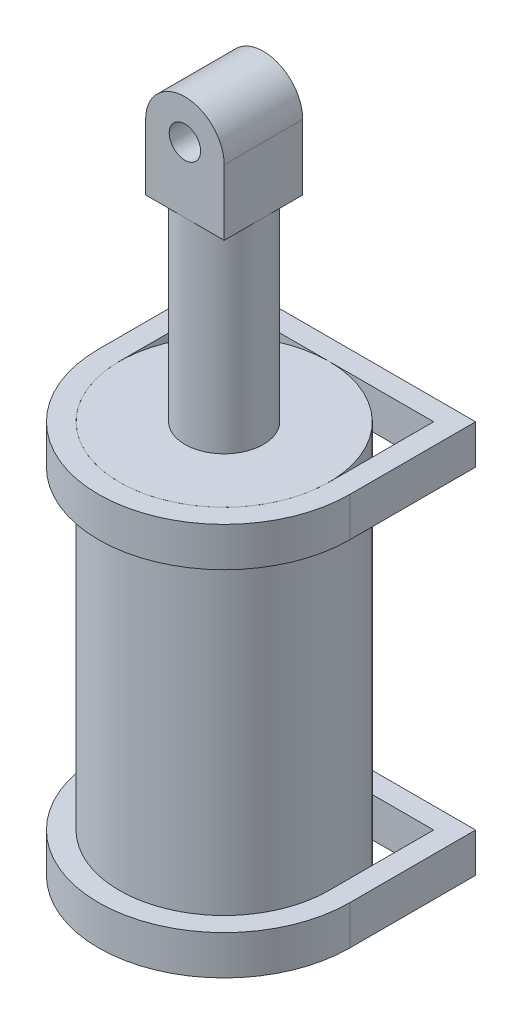
ISO-10303-21;
HEADER;
FILE_DESCRIPTION(('STEP AP214'),'2;1');
FILE_NAME('part.step','',(''),(''),'','','');
FILE_SCHEMA(('AUTOMOTIVE_DESIGN { 1 0 10303 214 1 1 1 1 }'));
ENDSEC;
DATA;
#1=APPLICATION_CONTEXT('core data for automotive mechanical design processes');
#2=APPLICATION_PROTOCOL_DEFINITION('international standard','automotive_design',2000,#1);
#3=PRODUCT_CONTEXT('',#1,'mechanical');
#4=PRODUCT('Part','Part','',(#3));
#5=PRODUCT_RELATED_PRODUCT_CATEGORY('part','',(#4));
#6=PRODUCT_DEFINITION_FORMATION('','',#4);
#7=PRODUCT_DEFINITION_CONTEXT('part definition',#1,'design');
#8=PRODUCT_DEFINITION('design','',#6,#7);
#9=PRODUCT_DEFINITION_SHAPE('','',#8);
#10=(LENGTH_UNIT() NAMED_UNIT(*) SI_UNIT(.MILLI.,.METRE.));
#11=(NAMED_UNIT(*) PLANE_ANGLE_UNIT() SI_UNIT($,.RADIAN.));
#12=(NAMED_UNIT(*) SI_UNIT($,.STERADIAN.) SOLID_ANGLE_UNIT());
#13=UNCERTAINTY_MEASURE_WITH_UNIT(LENGTH_MEASURE(1.E-05),#10,'distance_accuracy_value','');
#14=(GEOMETRIC_REPRESENTATION_CONTEXT(3) GLOBAL_UNCERTAINTY_ASSIGNED_CONTEXT((#13)) GLOBAL_UNIT_ASSIGNED_CONTEXT((#10,
#11,#12)) REPRESENTATION_CONTEXT('',''));
#15=CARTESIAN_POINT('',(0.,0.,0.));
#16=DIRECTION('',(0.,0.,1.));
#17=DIRECTION('',(1.,0.,0.));
#18=AXIS2_PLACEMENT_3D('',#15,#16,#17);
#19=CARTESIAN_POINT('',(0.,60.,0.));
#20=DIRECTION('',(0.,1.,0.));
#21=DIRECTION('',(0.,0.,1.));
#22=AXIS2_PLACEMENT_3D('',#19,#20,#21);
#23=CYLINDRICAL_SURFACE('',#22,48.);
#24=CARTESIAN_POINT('',(0.,75.,0.));
#25=DIRECTION('',(0.,1.,0.));
#26=DIRECTION('',(0.,0.,1.));
#27=AXIS2_PLACEMENT_3D('',#24,#25,#26);
#28=CIRCLE('',#27,48.);
#29=CARTESIAN_POINT('',(-48.,75.,0.));
#30=VERTEX_POINT('',#29);
#31=CARTESIAN_POINT('',(48.,75.,0.));
#32=VERTEX_POINT('',#31);
#33=EDGE_CURVE('E144',#30,#32,#28,.T.);
#34=ORIENTED_EDGE('',*,*,#33,.F.);
#35=DIRECTION('',(0.,1.,0.));
#36=VECTOR('',#35,1.);
#37=CARTESIAN_POINT('',(-48.,60.,0.));
#38=LINE('',#37,#36);
#39=CARTESIAN_POINT('',(-48.,60.,0.));
#40=VERTEX_POINT('',#39);
#41=EDGE_CURVE('E12',#40,#30,#38,.T.);
#42=ORIENTED_EDGE('',*,*,#41,.F.);
#43=CARTESIAN_POINT('',(0.,60.,0.));
#44=DIRECTION('',(0.,1.,0.));
#45=DIRECTION('',(0.,0.,1.));
#46=AXIS2_PLACEMENT_3D('',#43,#44,#45);
#47=CIRCLE('',#46,48.);
#48=CARTESIAN_POINT('',(48.,60.,0.));
#49=VERTEX_POINT('',#48);
#50=EDGE_CURVE('E137',#40,#49,#47,.T.);
#51=ORIENTED_EDGE('',*,*,#50,.T.);
#52=DIRECTION('',(0.,1.,0.));
#53=VECTOR('',#52,1.);
#54=CARTESIAN_POINT('',(48.,60.,0.));
#55=LINE('',#54,#53);
#56=EDGE_CURVE('E53',#49,#32,#55,.T.);
#57=ORIENTED_EDGE('',*,*,#56,.T.);
#58=EDGE_LOOP('',(#34,#42,#51,#57));
#59=FACE_BOUND('',#58,.T.);
#60=ADVANCED_FACE('F50',(#59),#23,.T.);
#61=CARTESIAN_POINT('',(-48.,60.,-40.));
#62=DIRECTION('',(-1.,0.,0.));
#63=DIRECTION('',(0.,0.,1.));
#64=AXIS2_PLACEMENT_3D('',#61,#62,#63);
#65=PLANE('',#64);
#66=DIRECTION('',(0.,0.,1.));
#67=VECTOR('',#66,1.);
#68=CARTESIAN_POINT('',(-48.,75.,-40.));
#69=LINE('',#68,#67);
#70=CARTESIAN_POINT('',(-48.,75.,-48.));
#71=VERTEX_POINT('',#70);
#72=EDGE_CURVE('E139',#71,#30,#69,.T.);
#73=ORIENTED_EDGE('',*,*,#72,.F.);
#74=DIRECTION('',(0.,-1.,0.));
#75=VECTOR('',#74,1.);
#76=CARTESIAN_POINT('',(-48.,60.,-48.));
#77=LINE('',#76,#75);
#78=CARTESIAN_POINT('',(-48.,60.,-48.));
#79=VERTEX_POINT('',#78);
#80=EDGE_CURVE('E134',#71,#79,#77,.T.);
#81=ORIENTED_EDGE('',*,*,#80,.T.);
#82=DIRECTION('',(0.,0.,1.));
#83=VECTOR('',#82,1.);
#84=CARTESIAN_POINT('',(-48.,60.,-40.));
#85=LINE('',#84,#83);
#86=EDGE_CURVE('E121',#79,#40,#85,.T.);
#87=ORIENTED_EDGE('',*,*,#86,.T.);
#88=ORIENTED_EDGE('',*,*,#41,.T.);
#89=EDGE_LOOP('',(#73,#81,#87,#88));
#90=FACE_BOUND('',#89,.T.);
#91=ADVANCED_FACE('F157',(#90),#65,.T.);
#92=CARTESIAN_POINT('',(40.,60.,-48.));
#93=DIRECTION('',(0.,0.,-1.));
#94=DIRECTION('',(-1.,0.,0.));
#95=AXIS2_PLACEMENT_3D('',#92,#93,#94);
#96=PLANE('',#95);
#97=ORIENTED_EDGE('',*,*,#80,.F.);
#98=DIRECTION('',(-1.,0.,0.));
#99=VECTOR('',#98,1.);
#100=CARTESIAN_POINT('',(40.,75.,-48.));
#101=LINE('',#100,#99);
#102=CARTESIAN_POINT('',(48.,75.,-48.));
#103=VERTEX_POINT('',#102);
#104=EDGE_CURVE('E130',#103,#71,#101,.T.);
#105=ORIENTED_EDGE('',*,*,#104,.F.);
#106=DIRECTION('',(0.,-1.,0.));
#107=VECTOR('',#106,1.);
#108=CARTESIAN_POINT('',(48.,60.,-48.));
#109=LINE('',#108,#107);
#110=CARTESIAN_POINT('',(48.,60.,-48.));
#111=VERTEX_POINT('',#110);
#112=EDGE_CURVE('E127',#103,#111,#109,.T.);
#113=ORIENTED_EDGE('',*,*,#112,.T.);
#114=DIRECTION('',(-1.,0.,0.));
#115=VECTOR('',#114,1.);
#116=CARTESIAN_POINT('',(40.,60.,-48.));
#117=LINE('',#116,#115);
#118=EDGE_CURVE('E113',#111,#79,#117,.T.);
#119=ORIENTED_EDGE('',*,*,#118,.T.);
#120=EDGE_LOOP('',(#97,#105,#113,#119));
#121=FACE_BOUND('',#120,.T.);
#122=ADVANCED_FACE('F128',(#121),#96,.T.);
#123=CARTESIAN_POINT('',(48.,60.,0.));
#124=DIRECTION('',(1.,0.,0.));
#125=DIRECTION('',(0.,0.,-1.));
#126=AXIS2_PLACEMENT_3D('',#123,#124,#125);
#127=PLANE('',#126);
#128=ORIENTED_EDGE('',*,*,#112,.F.);
#129=DIRECTION('',(0.,0.,-1.));
#130=VECTOR('',#129,1.);
#131=CARTESIAN_POINT('',(48.,75.,0.));
#132=LINE('',#131,#130);
#133=EDGE_CURVE('E147',#32,#103,#132,.T.);
#134=ORIENTED_EDGE('',*,*,#133,.F.);
#135=ORIENTED_EDGE('',*,*,#56,.F.);
#136=DIRECTION('',(0.,0.,-1.));
#137=VECTOR('',#136,1.);
#138=CARTESIAN_POINT('',(48.,60.,0.));
#139=LINE('',#138,#137);
#140=EDGE_CURVE('E118',#49,#111,#139,.T.);
#141=ORIENTED_EDGE('',*,*,#140,.T.);
#142=EDGE_LOOP('',(#128,#134,#135,#141));
#143=FACE_BOUND('',#142,.T.);
#144=ADVANCED_FACE('F136',(#143),#127,.T.);
#145=CARTESIAN_POINT('',(0.,60.,0.));
#146=DIRECTION('',(0.,1.,0.));
#147=DIRECTION('',(0.,0.,1.));
#148=AXIS2_PLACEMENT_3D('',#145,#146,#147);
#149=PLANE('',#148);
#150=DIRECTION('',(0.,0.,-1.));
#151=VECTOR('',#150,1.);
#152=CARTESIAN_POINT('',(40.,60.,-40.));
#153=LINE('',#152,#151);
#154=CARTESIAN_POINT('',(40.,60.,0.));
#155=VERTEX_POINT('',#154);
#156=CARTESIAN_POINT('',(40.,60.,-40.));
#157=VERTEX_POINT('',#156);
#158=EDGE_CURVE('E170',#155,#157,#153,.T.);
#159=ORIENTED_EDGE('',*,*,#158,.T.);
#160=DIRECTION('',(-1.,0.,0.));
#161=VECTOR('',#160,1.);
#162=CARTESIAN_POINT('',(-40.,60.,-40.));
#163=LINE('',#162,#161);
#164=CARTESIAN_POINT('',(-40.,60.,-40.));
#165=VERTEX_POINT('',#164);
#166=EDGE_CURVE('E162',#157,#165,#163,.T.);
#167=ORIENTED_EDGE('',*,*,#166,.T.);
#168=DIRECTION('',(0.,0.,1.));
#169=VECTOR('',#168,1.);
#170=CARTESIAN_POINT('',(-40.,60.,0.));
#171=LINE('',#170,#169);
#172=CARTESIAN_POINT('',(-40.,60.,0.));
#173=VERTEX_POINT('',#172);
#174=EDGE_CURVE('E165',#165,#173,#171,.T.);
#175=ORIENTED_EDGE('',*,*,#174,.T.);
#176=CARTESIAN_POINT('',(0.,60.,0.));
#177=DIRECTION('',(0.,1.,0.));
#178=DIRECTION('',(0.,0.,1.));
#179=AXIS2_PLACEMENT_3D('',#176,#177,#178);
#180=CIRCLE('',#179,40.);
#181=EDGE_CURVE('E64',#173,#155,#180,.T.);
#182=ORIENTED_EDGE('',*,*,#181,.T.);
#183=EDGE_LOOP('',(#159,#167,#175,#182));
#184=FACE_BOUND('',#183,.T.);
#185=ORIENTED_EDGE('',*,*,#118,.F.);
#186=ORIENTED_EDGE('',*,*,#140,.F.);
#187=ORIENTED_EDGE('',*,*,#50,.F.);
#188=ORIENTED_EDGE('',*,*,#86,.F.);
#189=EDGE_LOOP('',(#185,#186,#187,#188));
#190=FACE_BOUND('',#189,.T.);
#191=ADVANCED_FACE('F115',(#184,#190),#149,.F.);
#192=CARTESIAN_POINT('',(0.,75.,0.));
#193=DIRECTION('',(0.,1.,0.));
#194=DIRECTION('',(0.,0.,1.));
#195=AXIS2_PLACEMENT_3D('',#192,#193,#194);
#196=PLANE('',#195);
#197=ORIENTED_EDGE('',*,*,#133,.T.);
#198=ORIENTED_EDGE('',*,*,#104,.T.);
#199=ORIENTED_EDGE('',*,*,#72,.T.);
#200=ORIENTED_EDGE('',*,*,#33,.T.);
#201=EDGE_LOOP('',(#197,#198,#199,#200));
#202=FACE_BOUND('',#201,.T.);
#203=DIRECTION('',(-1.,0.,0.));
#204=VECTOR('',#203,1.);
#205=CARTESIAN_POINT('',(-40.,75.,-40.));
#206=LINE('',#205,#204);
#207=CARTESIAN_POINT('',(40.,75.,-40.));
#208=VERTEX_POINT('',#207);
#209=CARTESIAN_POINT('',(-40.,75.,-40.));
#210=VERTEX_POINT('',#209);
#211=EDGE_CURVE('E72',#208,#210,#206,.T.);
#212=ORIENTED_EDGE('',*,*,#211,.F.);
#213=DIRECTION('',(0.,0.,-1.));
#214=VECTOR('',#213,1.);
#215=CARTESIAN_POINT('',(40.,75.,-40.));
#216=LINE('',#215,#214);
#217=CARTESIAN_POINT('',(40.,75.,0.));
#218=VERTEX_POINT('',#217);
#219=EDGE_CURVE('E166',#218,#208,#216,.T.);
#220=ORIENTED_EDGE('',*,*,#219,.F.);
#221=CARTESIAN_POINT('',(0.,75.,0.));
#222=DIRECTION('',(0.,1.,0.));
#223=DIRECTION('',(0.,0.,1.));
#224=AXIS2_PLACEMENT_3D('',#221,#222,#223);
#225=CIRCLE('',#224,40.);
#226=CARTESIAN_POINT('',(-40.,75.,0.));
#227=VERTEX_POINT('',#226);
#228=EDGE_CURVE('E176',#227,#218,#225,.T.);
#229=ORIENTED_EDGE('',*,*,#228,.F.);
#230=DIRECTION('',(0.,0.,1.));
#231=VECTOR('',#230,1.);
#232=CARTESIAN_POINT('',(-40.,75.,0.));
#233=LINE('',#232,#231);
#234=EDGE_CURVE('E159',#210,#227,#233,.T.);
#235=ORIENTED_EDGE('',*,*,#234,.F.);
#236=EDGE_LOOP('',(#212,#220,#229,#235));
#237=FACE_BOUND('',#236,.T.);
#238=ADVANCED_FACE('F153',(#202,#237),#196,.T.);
#239=CARTESIAN_POINT('',(-40.,60.,-40.));
#240=DIRECTION('',(0.,0.,-1.));
#241=DIRECTION('',(-1.,0.,0.));
#242=AXIS2_PLACEMENT_3D('',#239,#240,#241);
#243=PLANE('',#242);
#244=ORIENTED_EDGE('',*,*,#211,.T.);
#245=DIRECTION('',(0.,1.,0.));
#246=VECTOR('',#245,1.);
#247=CARTESIAN_POINT('',(-40.,60.,-40.));
#248=LINE('',#247,#246);
#249=EDGE_CURVE('E172',#165,#210,#248,.T.);
#250=ORIENTED_EDGE('',*,*,#249,.F.);
#251=ORIENTED_EDGE('',*,*,#166,.F.);
#252=DIRECTION('',(0.,1.,0.));
#253=VECTOR('',#252,1.);
#254=CARTESIAN_POINT('',(40.,60.,-40.));
#255=LINE('',#254,#253);
#256=EDGE_CURVE('E148',#157,#208,#255,.T.);
#257=ORIENTED_EDGE('',*,*,#256,.T.);
#258=EDGE_LOOP('',(#244,#250,#251,#257));
#259=FACE_BOUND('',#258,.T.);
#260=ADVANCED_FACE('F195',(#259),#243,.F.);
#261=CARTESIAN_POINT('',(40.,60.,-40.));
#262=DIRECTION('',(1.,0.,0.));
#263=DIRECTION('',(0.,0.,-1.));
#264=AXIS2_PLACEMENT_3D('',#261,#262,#263);
#265=PLANE('',#264);
#266=ORIENTED_EDGE('',*,*,#219,.T.);
#267=ORIENTED_EDGE('',*,*,#256,.F.);
#268=ORIENTED_EDGE('',*,*,#158,.F.);
#269=DIRECTION('',(0.,1.,0.));
#270=VECTOR('',#269,1.);
#271=CARTESIAN_POINT('',(40.,60.,0.));
#272=LINE('',#271,#270);
#273=EDGE_CURVE('E182',#155,#218,#272,.T.);
#274=ORIENTED_EDGE('',*,*,#273,.T.);
#275=EDGE_LOOP('',(#266,#267,#268,#274));
#276=FACE_BOUND('',#275,.T.);
#277=ADVANCED_FACE('F197',(#276),#265,.F.);
#278=CARTESIAN_POINT('',(0.,60.,0.));
#279=DIRECTION('',(0.,1.,0.));
#280=DIRECTION('',(0.,0.,1.));
#281=AXIS2_PLACEMENT_3D('',#278,#279,#280);
#282=CYLINDRICAL_SURFACE('',#281,40.);
#283=ORIENTED_EDGE('',*,*,#228,.T.);
#284=ORIENTED_EDGE('',*,*,#273,.F.);
#285=ORIENTED_EDGE('',*,*,#181,.F.);
#286=DIRECTION('',(0.,1.,0.));
#287=VECTOR('',#286,1.);
#288=CARTESIAN_POINT('',(-40.,60.,0.));
#289=LINE('',#288,#287);
#290=EDGE_CURVE('E184',#173,#227,#289,.T.);
#291=ORIENTED_EDGE('',*,*,#290,.T.);
#292=EDGE_LOOP('',(#283,#284,#285,#291));
#293=FACE_BOUND('',#292,.T.);
#294=ADVANCED_FACE('F192',(#293),#282,.F.);
#295=CARTESIAN_POINT('',(-40.,60.,0.));
#296=DIRECTION('',(-1.,0.,0.));
#297=DIRECTION('',(0.,0.,1.));
#298=AXIS2_PLACEMENT_3D('',#295,#296,#297);
#299=PLANE('',#298);
#300=ORIENTED_EDGE('',*,*,#234,.T.);
#301=ORIENTED_EDGE('',*,*,#290,.F.);
#302=ORIENTED_EDGE('',*,*,#174,.F.);
#303=ORIENTED_EDGE('',*,*,#249,.T.);
#304=EDGE_LOOP('',(#300,#301,#302,#303));
#305=FACE_BOUND('',#304,.T.);
#306=ADVANCED_FACE('F188',(#305),#299,.F.);
#307=CLOSED_SHELL('',(#60,#91,#122,#144,#191,#238,#260,#277,#294,#306));
#308=MANIFOLD_SOLID_BREP('B2',#307);
#309=CARTESIAN_POINT('',(0.,-60.,0.));
#310=DIRECTION('',(0.,-1.,0.));
#311=DIRECTION('',(0.,0.,-1.));
#312=AXIS2_PLACEMENT_3D('',#309,#310,#311);
#313=CYLINDRICAL_SURFACE('',#312,48.);
#314=CARTESIAN_POINT('',(0.,-75.,0.));
#315=DIRECTION('',(0.,-1.,0.));
#316=DIRECTION('',(0.,0.,-1.));
#317=AXIS2_PLACEMENT_3D('',#314,#315,#316);
#318=CIRCLE('',#317,48.);
#319=CARTESIAN_POINT('',(48.,-75.,0.));
#320=VERTEX_POINT('',#319);
#321=CARTESIAN_POINT('',(-48.,-75.,0.));
#322=VERTEX_POINT('',#321);
#323=EDGE_CURVE('E383',#320,#322,#318,.T.);
#324=ORIENTED_EDGE('',*,*,#323,.F.);
#325=DIRECTION('',(0.,-1.,0.));
#326=VECTOR('',#325,1.);
#327=CARTESIAN_POINT('',(48.,-60.,0.));
#328=LINE('',#327,#326);
#329=CARTESIAN_POINT('',(48.,-60.,0.));
#330=VERTEX_POINT('',#329);
#331=EDGE_CURVE('E48',#330,#320,#328,.T.);
#332=ORIENTED_EDGE('',*,*,#331,.F.);
#333=CARTESIAN_POINT('',(0.,-60.,0.));
#334=DIRECTION('',(0.,-1.,0.));
#335=DIRECTION('',(0.,0.,-1.));
#336=AXIS2_PLACEMENT_3D('',#333,#334,#335);
#337=CIRCLE('',#336,48.);
#338=CARTESIAN_POINT('',(-48.,-60.,0.));
#339=VERTEX_POINT('',#338);
#340=EDGE_CURVE('E379',#330,#339,#337,.T.);
#341=ORIENTED_EDGE('',*,*,#340,.T.);
#342=DIRECTION('',(0.,-1.,0.));
#343=VECTOR('',#342,1.);
#344=CARTESIAN_POINT('',(-48.,-60.,0.));
#345=LINE('',#344,#343);
#346=EDGE_CURVE('E298',#339,#322,#345,.T.);
#347=ORIENTED_EDGE('',*,*,#346,.T.);
#348=EDGE_LOOP('',(#324,#332,#341,#347));
#349=FACE_BOUND('',#348,.T.);
#350=ADVANCED_FACE('F295',(#349),#313,.T.);
#351=CARTESIAN_POINT('',(48.,-60.,-40.));
#352=DIRECTION('',(1.,0.,0.));
#353=DIRECTION('',(0.,0.,-1.));
#354=AXIS2_PLACEMENT_3D('',#351,#352,#353);
#355=PLANE('',#354);
#356=DIRECTION('',(0.,-1.,0.));
#357=VECTOR('',#356,1.);
#358=CARTESIAN_POINT('',(48.,-60.,-48.));
#359=LINE('',#358,#357);
#360=CARTESIAN_POINT('',(48.,-60.,-48.));
#361=VERTEX_POINT('',#360);
#362=CARTESIAN_POINT('',(48.,-75.,-48.));
#363=VERTEX_POINT('',#362);
#364=EDGE_CURVE('E362',#361,#363,#359,.T.);
#365=ORIENTED_EDGE('',*,*,#364,.F.);
#366=DIRECTION('',(0.,0.,1.));
#367=VECTOR('',#366,1.);
#368=CARTESIAN_POINT('',(48.,-60.,-40.));
#369=LINE('',#368,#367);
#370=EDGE_CURVE('E368',#361,#330,#369,.T.);
#371=ORIENTED_EDGE('',*,*,#370,.T.);
#372=ORIENTED_EDGE('',*,*,#331,.T.);
#373=DIRECTION('',(0.,0.,1.));
#374=VECTOR('',#373,1.);
#375=CARTESIAN_POINT('',(48.,-75.,-40.));
#376=LINE('',#375,#374);
#377=EDGE_CURVE('E374',#363,#320,#376,.T.);
#378=ORIENTED_EDGE('',*,*,#377,.F.);
#379=EDGE_LOOP('',(#365,#371,#372,#378));
#380=FACE_BOUND('',#379,.T.);
#381=ADVANCED_FACE('F372',(#380),#355,.T.);
#382=CARTESIAN_POINT('',(40.,-60.,-48.));
#383=DIRECTION('',(0.,0.,-1.));
#384=DIRECTION('',(-1.,0.,0.));
#385=AXIS2_PLACEMENT_3D('',#382,#383,#384);
#386=PLANE('',#385);
#387=DIRECTION('',(0.,-1.,0.));
#388=VECTOR('',#387,1.);
#389=CARTESIAN_POINT('',(-48.,-60.,-48.));
#390=LINE('',#389,#388);
#391=CARTESIAN_POINT('',(-48.,-60.,-48.));
#392=VERTEX_POINT('',#391);
#393=CARTESIAN_POINT('',(-48.,-75.,-48.));
#394=VERTEX_POINT('',#393);
#395=EDGE_CURVE('E364',#392,#394,#390,.T.);
#396=ORIENTED_EDGE('',*,*,#395,.F.);
#397=DIRECTION('',(1.,0.,0.));
#398=VECTOR('',#397,1.);
#399=CARTESIAN_POINT('',(-58.,-60.,-48.));
#400=LINE('',#399,#398);
#401=EDGE_CURVE('E359',#392,#361,#400,.T.);
#402=ORIENTED_EDGE('',*,*,#401,.T.);
#403=ORIENTED_EDGE('',*,*,#364,.T.);
#404=DIRECTION('',(1.,0.,0.));
#405=VECTOR('',#404,1.);
#406=CARTESIAN_POINT('',(40.,-75.,-48.));
#407=LINE('',#406,#405);
#408=EDGE_CURVE('E309',#394,#363,#407,.T.);
#409=ORIENTED_EDGE('',*,*,#408,.F.);
#410=EDGE_LOOP('',(#396,#402,#403,#409));
#411=FACE_BOUND('',#410,.T.);
#412=ADVANCED_FACE('F361',(#411),#386,.T.);
#413=CARTESIAN_POINT('',(-48.,-60.,0.));
#414=DIRECTION('',(-1.,0.,0.));
#415=DIRECTION('',(0.,0.,1.));
#416=AXIS2_PLACEMENT_3D('',#413,#414,#415);
#417=PLANE('',#416);
#418=DIRECTION('',(0.,0.,-1.));
#419=VECTOR('',#418,1.);
#420=CARTESIAN_POINT('',(-48.,-75.,0.));
#421=LINE('',#420,#419);
#422=EDGE_CURVE('E314',#322,#394,#421,.T.);
#423=ORIENTED_EDGE('',*,*,#422,.F.);
#424=ORIENTED_EDGE('',*,*,#346,.F.);
#425=DIRECTION('',(0.,0.,-1.));
#426=VECTOR('',#425,1.);
#427=CARTESIAN_POINT('',(-48.,-60.,0.));
#428=LINE('',#427,#426);
#429=EDGE_CURVE('E369',#339,#392,#428,.T.);
#430=ORIENTED_EDGE('',*,*,#429,.T.);
#431=ORIENTED_EDGE('',*,*,#395,.T.);
#432=EDGE_LOOP('',(#423,#424,#430,#431));
#433=FACE_BOUND('',#432,.T.);
#434=ADVANCED_FACE('F423',(#433),#417,.T.);
#435=CARTESIAN_POINT('',(0.,-60.,0.));
#436=DIRECTION('',(0.,-1.,0.));
#437=DIRECTION('',(0.,0.,-1.));
#438=AXIS2_PLACEMENT_3D('',#435,#436,#437);
#439=PLANE('',#438);
#440=DIRECTION('',(0.,0.,1.));
#441=VECTOR('',#440,1.);
#442=CARTESIAN_POINT('',(40.,-60.,-40.));
#443=LINE('',#442,#441);
#444=CARTESIAN_POINT('',(40.,-60.,-40.));
#445=VERTEX_POINT('',#444);
#446=CARTESIAN_POINT('',(40.,-60.,0.));
#447=VERTEX_POINT('',#446);
#448=EDGE_CURVE('E395',#445,#447,#443,.T.);
#449=ORIENTED_EDGE('',*,*,#448,.T.);
#450=CARTESIAN_POINT('',(0.,-60.,0.));
#451=DIRECTION('',(0.,-1.,0.));
#452=DIRECTION('',(0.,0.,-1.));
#453=AXIS2_PLACEMENT_3D('',#450,#451,#452);
#454=CIRCLE('',#453,40.);
#455=CARTESIAN_POINT('',(-40.,-60.,0.));
#456=VERTEX_POINT('',#455);
#457=EDGE_CURVE('E403',#447,#456,#454,.T.);
#458=ORIENTED_EDGE('',*,*,#457,.T.);
#459=DIRECTION('',(0.,0.,-1.));
#460=VECTOR('',#459,1.);
#461=CARTESIAN_POINT('',(-40.,-60.,0.));
#462=LINE('',#461,#460);
#463=CARTESIAN_POINT('',(-40.,-60.,-40.));
#464=VERTEX_POINT('',#463);
#465=EDGE_CURVE('E417',#456,#464,#462,.T.);
#466=ORIENTED_EDGE('',*,*,#465,.T.);
#467=DIRECTION('',(1.,0.,0.));
#468=VECTOR('',#467,1.);
#469=CARTESIAN_POINT('',(-40.,-60.,-40.));
#470=LINE('',#469,#468);
#471=EDGE_CURVE('E414',#464,#445,#470,.T.);
#472=ORIENTED_EDGE('',*,*,#471,.T.);
#473=EDGE_LOOP('',(#449,#458,#466,#472));
#474=FACE_BOUND('',#473,.T.);
#475=ORIENTED_EDGE('',*,*,#370,.F.);
#476=ORIENTED_EDGE('',*,*,#401,.F.);
#477=ORIENTED_EDGE('',*,*,#429,.F.);
#478=ORIENTED_EDGE('',*,*,#340,.F.);
#479=EDGE_LOOP('',(#475,#476,#477,#478));
#480=FACE_BOUND('',#479,.T.);
#481=ADVANCED_FACE('F377',(#474,#480),#439,.F.);
#482=CARTESIAN_POINT('',(0.,-75.,0.));
#483=DIRECTION('',(0.,-1.,0.));
#484=DIRECTION('',(0.,0.,-1.));
#485=AXIS2_PLACEMENT_3D('',#482,#483,#484);
#486=PLANE('',#485);
#487=ORIENTED_EDGE('',*,*,#408,.T.);
#488=ORIENTED_EDGE('',*,*,#377,.T.);
#489=ORIENTED_EDGE('',*,*,#323,.T.);
#490=ORIENTED_EDGE('',*,*,#422,.T.);
#491=EDGE_LOOP('',(#487,#488,#489,#490));
#492=FACE_BOUND('',#491,.T.);
#493=CARTESIAN_POINT('',(0.,-75.,0.));
#494=DIRECTION('',(0.,-1.,0.));
#495=DIRECTION('',(0.,0.,-1.));
#496=AXIS2_PLACEMENT_3D('',#493,#494,#495);
#497=CIRCLE('',#496,40.);
#498=CARTESIAN_POINT('',(40.,-75.,0.));
#499=VERTEX_POINT('',#498);
#500=CARTESIAN_POINT('',(-40.,-75.,0.));
#501=VERTEX_POINT('',#500);
#502=EDGE_CURVE('E410',#499,#501,#497,.T.);
#503=ORIENTED_EDGE('',*,*,#502,.F.);
#504=DIRECTION('',(0.,0.,1.));
#505=VECTOR('',#504,1.);
#506=CARTESIAN_POINT('',(40.,-75.,-40.));
#507=LINE('',#506,#505);
#508=CARTESIAN_POINT('',(40.,-75.,-40.));
#509=VERTEX_POINT('',#508);
#510=EDGE_CURVE('E400',#509,#499,#507,.T.);
#511=ORIENTED_EDGE('',*,*,#510,.F.);
#512=DIRECTION('',(1.,0.,0.));
#513=VECTOR('',#512,1.);
#514=CARTESIAN_POINT('',(-40.,-75.,-40.));
#515=LINE('',#514,#513);
#516=CARTESIAN_POINT('',(-40.,-75.,-40.));
#517=VERTEX_POINT('',#516);
#518=EDGE_CURVE('E404',#517,#509,#515,.T.);
#519=ORIENTED_EDGE('',*,*,#518,.F.);
#520=DIRECTION('',(0.,0.,-1.));
#521=VECTOR('',#520,1.);
#522=CARTESIAN_POINT('',(-40.,-75.,0.));
#523=LINE('',#522,#521);
#524=EDGE_CURVE('E407',#501,#517,#523,.T.);
#525=ORIENTED_EDGE('',*,*,#524,.F.);
#526=EDGE_LOOP('',(#503,#511,#519,#525));
#527=FACE_BOUND('',#526,.T.);
#528=ADVANCED_FACE('F425',(#492,#527),#486,.T.);
#529=CARTESIAN_POINT('',(0.,-60.,0.));
#530=DIRECTION('',(0.,-1.,0.));
#531=DIRECTION('',(0.,0.,-1.));
#532=AXIS2_PLACEMENT_3D('',#529,#530,#531);
#533=CYLINDRICAL_SURFACE('',#532,40.);
#534=ORIENTED_EDGE('',*,*,#502,.T.);
#535=DIRECTION('',(0.,-1.,0.));
#536=VECTOR('',#535,1.);
#537=CARTESIAN_POINT('',(-40.,-60.,0.));
#538=LINE('',#537,#536);
#539=EDGE_CURVE('E391',#456,#501,#538,.T.);
#540=ORIENTED_EDGE('',*,*,#539,.F.);
#541=ORIENTED_EDGE('',*,*,#457,.F.);
#542=DIRECTION('',(0.,-1.,0.));
#543=VECTOR('',#542,1.);
#544=CARTESIAN_POINT('',(40.,-60.,0.));
#545=LINE('',#544,#543);
#546=EDGE_CURVE('E385',#447,#499,#545,.T.);
#547=ORIENTED_EDGE('',*,*,#546,.T.);
#548=EDGE_LOOP('',(#534,#540,#541,#547));
#549=FACE_BOUND('',#548,.T.);
#550=ADVANCED_FACE('F428',(#549),#533,.F.);
#551=CARTESIAN_POINT('',(40.,-60.,-40.));
#552=DIRECTION('',(1.,0.,0.));
#553=DIRECTION('',(0.,0.,-1.));
#554=AXIS2_PLACEMENT_3D('',#551,#552,#553);
#555=PLANE('',#554);
#556=ORIENTED_EDGE('',*,*,#510,.T.);
#557=ORIENTED_EDGE('',*,*,#546,.F.);
#558=ORIENTED_EDGE('',*,*,#448,.F.);
#559=DIRECTION('',(0.,-1.,0.));
#560=VECTOR('',#559,1.);
#561=CARTESIAN_POINT('',(40.,-60.,-40.));
#562=LINE('',#561,#560);
#563=EDGE_CURVE('E397',#445,#509,#562,.T.);
#564=ORIENTED_EDGE('',*,*,#563,.T.);
#565=EDGE_LOOP('',(#556,#557,#558,#564));
#566=FACE_BOUND('',#565,.T.);
#567=ADVANCED_FACE('F443',(#566),#555,.F.);
#568=CARTESIAN_POINT('',(-40.,-60.,-40.));
#569=DIRECTION('',(0.,0.,-1.));
#570=DIRECTION('',(-1.,0.,0.));
#571=AXIS2_PLACEMENT_3D('',#568,#569,#570);
#572=PLANE('',#571);
#573=ORIENTED_EDGE('',*,*,#518,.T.);
#574=ORIENTED_EDGE('',*,*,#563,.F.);
#575=ORIENTED_EDGE('',*,*,#471,.F.);
#576=DIRECTION('',(0.,-1.,0.));
#577=VECTOR('',#576,1.);
#578=CARTESIAN_POINT('',(-40.,-60.,-40.));
#579=LINE('',#578,#577);
#580=EDGE_CURVE('E394',#464,#517,#579,.T.);
#581=ORIENTED_EDGE('',*,*,#580,.T.);
#582=EDGE_LOOP('',(#573,#574,#575,#581));
#583=FACE_BOUND('',#582,.T.);
#584=ADVANCED_FACE('F445',(#583),#572,.F.);
#585=CARTESIAN_POINT('',(-40.,-60.,0.));
#586=DIRECTION('',(-1.,0.,0.));
#587=DIRECTION('',(0.,0.,1.));
#588=AXIS2_PLACEMENT_3D('',#585,#586,#587);
#589=PLANE('',#588);
#590=ORIENTED_EDGE('',*,*,#524,.T.);
#591=ORIENTED_EDGE('',*,*,#580,.F.);
#592=ORIENTED_EDGE('',*,*,#465,.F.);
#593=ORIENTED_EDGE('',*,*,#539,.T.);
#594=EDGE_LOOP('',(#590,#591,#592,#593));
#595=FACE_BOUND('',#594,.T.);
#596=ADVANCED_FACE('F438',(#595),#589,.F.);
#597=CLOSED_SHELL('',(#350,#381,#412,#434,#481,#528,#550,#567,#584,#596));
#598=MANIFOLD_SOLID_BREP('B6',#597);
#599=CARTESIAN_POINT('',(0.,75.,0.));
#600=DIRECTION('',(0.,-1.,0.));
#601=DIRECTION('',(0.,0.,-1.));
#602=AXIS2_PLACEMENT_3D('',#599,#600,#601);
#603=CYLINDRICAL_SURFACE('',#602,40.);
#604=CARTESIAN_POINT('',(0.,75.,0.));
#605=DIRECTION('',(0.,1.,0.));
#606=DIRECTION('',(0.,0.,1.));
#607=AXIS2_PLACEMENT_3D('',#604,#605,#606);
#608=CIRCLE('',#607,40.);
#609=CARTESIAN_POINT('',(0.,75.,40.));
#610=VERTEX_POINT('',#609);
#611=EDGE_CURVE('E546',#610,#610,#608,.T.);
#612=ORIENTED_EDGE('',*,*,#611,.F.);
#613=EDGE_LOOP('',(#612));
#614=FACE_BOUND('',#613,.T.);
#615=CARTESIAN_POINT('',(0.,-75.,0.));
#616=DIRECTION('',(0.,1.,0.));
#617=DIRECTION('',(0.,0.,1.));
#618=AXIS2_PLACEMENT_3D('',#615,#616,#617);
#619=CIRCLE('',#618,40.);
#620=CARTESIAN_POINT('',(0.,-75.,40.));
#621=VERTEX_POINT('',#620);
#622=EDGE_CURVE('E659',#621,#621,#619,.T.);
#623=ORIENTED_EDGE('',*,*,#622,.T.);
#624=EDGE_LOOP('',(#623));
#625=FACE_BOUND('',#624,.T.);
#626=ADVANCED_FACE('F537',(#614,#625),#603,.T.);
#627=CARTESIAN_POINT('',(0.,75.,0.));
#628=DIRECTION('',(0.,1.,0.));
#629=DIRECTION('',(0.,0.,1.));
#630=AXIS2_PLACEMENT_3D('',#627,#628,#629);
#631=PLANE('',#630);
#632=CARTESIAN_POINT('',(0.,75.,0.));
#633=DIRECTION('',(0.,1.,0.));
#634=DIRECTION('',(0.,0.,1.));
#635=AXIS2_PLACEMENT_3D('',#632,#633,#634);
#636=CIRCLE('',#635,15.);
#637=CARTESIAN_POINT('',(0.,75.,15.));
#638=VERTEX_POINT('',#637);
#639=EDGE_CURVE('E293',#638,#638,#636,.T.);
#640=ORIENTED_EDGE('',*,*,#639,.F.);
#641=EDGE_LOOP('',(#640));
#642=FACE_BOUND('',#641,.T.);
#643=ORIENTED_EDGE('',*,*,#611,.T.);
#644=EDGE_LOOP('',(#643));
#645=FACE_BOUND('',#644,.T.);
#646=ADVANCED_FACE('F672',(#642,#645),#631,.T.);
#647=CARTESIAN_POINT('',(0.,-75.,0.));
#648=DIRECTION('',(0.,1.,0.));
#649=DIRECTION('',(0.,0.,1.));
#650=AXIS2_PLACEMENT_3D('',#647,#648,#649);
#651=PLANE('',#650);
#652=ORIENTED_EDGE('',*,*,#622,.F.);
#653=EDGE_LOOP('',(#652));
#654=FACE_BOUND('',#653,.T.);
#655=ADVANCED_FACE('F669',(#654),#651,.F.);
#656=CARTESIAN_POINT('',(0.,150.,0.));
#657=DIRECTION('',(0.,-1.,0.));
#658=DIRECTION('',(0.,0.,-1.));
#659=AXIS2_PLACEMENT_3D('',#656,#657,#658);
#660=CYLINDRICAL_SURFACE('',#659,15.);
#661=CARTESIAN_POINT('',(0.,150.,0.));
#662=DIRECTION('',(0.,1.,0.));
#663=DIRECTION('',(0.,0.,1.));
#664=AXIS2_PLACEMENT_3D('',#661,#662,#663);
#665=CIRCLE('',#664,15.);
#666=CARTESIAN_POINT('',(0.,150.,15.));
#667=VERTEX_POINT('',#666);
#668=CARTESIAN_POINT('',(15.,150.,0.));
#669=VERTEX_POINT('',#668);
#670=EDGE_CURVE('E656',#667,#669,#665,.T.);
#671=ORIENTED_EDGE('',*,*,#670,.F.);
#672=CARTESIAN_POINT('',(-15.,150.,0.));
#673=VERTEX_POINT('',#672);
#674=EDGE_CURVE('E554',#673,#667,#665,.T.);
#675=ORIENTED_EDGE('',*,*,#674,.F.);
#676=CARTESIAN_POINT('',(0.,150.,-15.));
#677=VERTEX_POINT('',#676);
#678=EDGE_CURVE('E558',#677,#673,#665,.T.);
#679=ORIENTED_EDGE('',*,*,#678,.F.);
#680=EDGE_CURVE('E660',#669,#677,#665,.T.);
#681=ORIENTED_EDGE('',*,*,#680,.F.);
#682=EDGE_LOOP('',(#671,#675,#679,#681));
#683=FACE_BOUND('',#682,.T.);
#684=ORIENTED_EDGE('',*,*,#639,.T.);
#685=EDGE_LOOP('',(#684));
#686=FACE_BOUND('',#685,.T.);
#687=ADVANCED_FACE('F671',(#683,#686),#660,.T.);
#688=CARTESIAN_POINT('',(0.,150.,0.));
#689=DIRECTION('',(0.,1.,0.));
#690=DIRECTION('',(0.,0.,1.));
#691=AXIS2_PLACEMENT_3D('',#688,#689,#690);
#692=PLANE('',#691);
#693=DIRECTION('',(1.,0.,0.));
#694=VECTOR('',#693,1.);
#695=CARTESIAN_POINT('',(-15.,150.,15.));
#696=LINE('',#695,#694);
#697=CARTESIAN_POINT('',(15.,150.,15.));
#698=VERTEX_POINT('',#697);
#699=EDGE_CURVE('E613',#667,#698,#696,.T.);
#700=ORIENTED_EDGE('',*,*,#699,.F.);
#701=ORIENTED_EDGE('',*,*,#670,.T.);
#702=DIRECTION('',(0.,0.,-1.));
#703=VECTOR('',#702,1.);
#704=CARTESIAN_POINT('',(15.,150.,-15.));
#705=LINE('',#704,#703);
#706=EDGE_CURVE('E633',#698,#669,#705,.T.);
#707=ORIENTED_EDGE('',*,*,#706,.F.);
#708=EDGE_LOOP('',(#700,#701,#707));
#709=FACE_BOUND('',#708,.T.);
#710=ADVANCED_FACE('F677',(#709),#692,.F.);
#711=CARTESIAN_POINT('',(15.,150.,-15.));
#712=VERTEX_POINT('',#711);
#713=EDGE_CURVE('E626',#669,#712,#705,.T.);
#714=ORIENTED_EDGE('',*,*,#713,.F.);
#715=ORIENTED_EDGE('',*,*,#680,.T.);
#716=DIRECTION('',(-1.,0.,0.));
#717=VECTOR('',#716,1.);
#718=CARTESIAN_POINT('',(-15.,150.,-15.));
#719=LINE('',#718,#717);
#720=EDGE_CURVE('E637',#712,#677,#719,.T.);
#721=ORIENTED_EDGE('',*,*,#720,.F.);
#722=EDGE_LOOP('',(#714,#715,#721));
#723=FACE_BOUND('',#722,.T.);
#724=ADVANCED_FACE('F708',(#723),#692,.F.);
#725=CARTESIAN_POINT('',(-15.,150.,-15.));
#726=VERTEX_POINT('',#725);
#727=EDGE_CURVE('E636',#677,#726,#719,.T.);
#728=ORIENTED_EDGE('',*,*,#727,.F.);
#729=ORIENTED_EDGE('',*,*,#678,.T.);
#730=DIRECTION('',(0.,0.,1.));
#731=VECTOR('',#730,1.);
#732=CARTESIAN_POINT('',(-15.,150.,-15.));
#733=LINE('',#732,#731);
#734=EDGE_CURVE('E642',#726,#673,#733,.T.);
#735=ORIENTED_EDGE('',*,*,#734,.F.);
#736=EDGE_LOOP('',(#728,#729,#735));
#737=FACE_BOUND('',#736,.T.);
#738=ADVANCED_FACE('F719',(#737),#692,.F.);
#739=CARTESIAN_POINT('',(-15.,150.,15.));
#740=VERTEX_POINT('',#739);
#741=EDGE_CURVE('E641',#673,#740,#733,.T.);
#742=ORIENTED_EDGE('',*,*,#741,.F.);
#743=ORIENTED_EDGE('',*,*,#674,.T.);
#744=EDGE_CURVE('E604',#740,#667,#696,.T.);
#745=ORIENTED_EDGE('',*,*,#744,.F.);
#746=EDGE_LOOP('',(#742,#743,#745));
#747=FACE_BOUND('',#746,.T.);
#748=ADVANCED_FACE('F711',(#747),#692,.F.);
#749=CARTESIAN_POINT('',(15.,175.,-15.));
#750=DIRECTION('',(-1.,0.,0.));
#751=DIRECTION('',(0.,0.,1.));
#752=AXIS2_PLACEMENT_3D('',#749,#750,#751);
#753=PLANE('',#752);
#754=ORIENTED_EDGE('',*,*,#706,.T.);
#755=ORIENTED_EDGE('',*,*,#713,.T.);
#756=DIRECTION('',(0.,-1.,0.));
#757=VECTOR('',#756,1.);
#758=CARTESIAN_POINT('',(15.,175.,-15.));
#759=LINE('',#758,#757);
#760=CARTESIAN_POINT('',(15.,175.,-15.));
#761=VERTEX_POINT('',#760);
#762=EDGE_CURVE('E597',#761,#712,#759,.T.);
#763=ORIENTED_EDGE('',*,*,#762,.F.);
#764=DIRECTION('',(0.,0.,-1.));
#765=VECTOR('',#764,1.);
#766=CARTESIAN_POINT('',(15.,175.,-15.));
#767=LINE('',#766,#765);
#768=CARTESIAN_POINT('',(15.,175.,15.));
#769=VERTEX_POINT('',#768);
#770=EDGE_CURVE('E590',#769,#761,#767,.T.);
#771=ORIENTED_EDGE('',*,*,#770,.F.);
#772=DIRECTION('',(0.,-1.,0.));
#773=VECTOR('',#772,1.);
#774=CARTESIAN_POINT('',(15.,175.,15.));
#775=LINE('',#774,#773);
#776=EDGE_CURVE('E594',#769,#698,#775,.T.);
#777=ORIENTED_EDGE('',*,*,#776,.T.);
#778=EDGE_LOOP('',(#754,#755,#763,#771,#777));
#779=FACE_BOUND('',#778,.T.);
#780=ADVANCED_FACE('F593',(#779),#753,.F.);
#781=CARTESIAN_POINT('',(-15.,175.,-15.));
#782=DIRECTION('',(0.,0.,1.));
#783=DIRECTION('',(1.,0.,0.));
#784=AXIS2_PLACEMENT_3D('',#781,#782,#783);
#785=PLANE('',#784);
#786=CARTESIAN_POINT('',(0.,175.,-15.));
#787=DIRECTION('',(0.,0.,1.));
#788=DIRECTION('',(1.,0.,0.));
#789=AXIS2_PLACEMENT_3D('',#786,#787,#788);
#790=CIRCLE('',#789,6.00000000000001);
#791=CARTESIAN_POINT('',(6.,175.,-15.));
#792=VERTEX_POINT('',#791);
#793=EDGE_CURVE('E622',#792,#792,#790,.T.);
#794=ORIENTED_EDGE('',*,*,#793,.T.);
#795=EDGE_LOOP('',(#794));
#796=FACE_BOUND('',#795,.T.);
#797=ORIENTED_EDGE('',*,*,#720,.T.);
#798=ORIENTED_EDGE('',*,*,#727,.T.);
#799=DIRECTION('',(0.,-1.,0.));
#800=VECTOR('',#799,1.);
#801=CARTESIAN_POINT('',(-15.,175.,-15.));
#802=LINE('',#801,#800);
#803=CARTESIAN_POINT('',(-15.,175.,-15.));
#804=VERTEX_POINT('',#803);
#805=EDGE_CURVE('E650',#804,#726,#802,.T.);
#806=ORIENTED_EDGE('',*,*,#805,.F.);
#807=CARTESIAN_POINT('',(0.,175.,-15.));
#808=DIRECTION('',(0.,0.,1.));
#809=DIRECTION('',(-1.,0.,0.));
#810=AXIS2_PLACEMENT_3D('',#807,#808,#809);
#811=CIRCLE('',#810,15.);
#812=EDGE_CURVE('E621',#761,#804,#811,.T.);
#813=ORIENTED_EDGE('',*,*,#812,.F.);
#814=ORIENTED_EDGE('',*,*,#762,.T.);
#815=EDGE_LOOP('',(#797,#798,#806,#813,#814));
#816=FACE_BOUND('',#815,.T.);
#817=ADVANCED_FACE('F744',(#796,#816),#785,.F.);
#818=CARTESIAN_POINT('',(-15.,175.,-15.));
#819=DIRECTION('',(1.,0.,0.));
#820=DIRECTION('',(0.,0.,-1.));
#821=AXIS2_PLACEMENT_3D('',#818,#819,#820);
#822=PLANE('',#821);
#823=ORIENTED_EDGE('',*,*,#734,.T.);
#824=ORIENTED_EDGE('',*,*,#741,.T.);
#825=DIRECTION('',(0.,-1.,0.));
#826=VECTOR('',#825,1.);
#827=CARTESIAN_POINT('',(-15.,175.,15.));
#828=LINE('',#827,#826);
#829=CARTESIAN_POINT('',(-15.,175.,15.));
#830=VERTEX_POINT('',#829);
#831=EDGE_CURVE('E615',#830,#740,#828,.T.);
#832=ORIENTED_EDGE('',*,*,#831,.F.);
#833=DIRECTION('',(0.,0.,1.));
#834=VECTOR('',#833,1.);
#835=CARTESIAN_POINT('',(-15.,175.,-15.));
#836=LINE('',#835,#834);
#837=EDGE_CURVE('E603',#804,#830,#836,.T.);
#838=ORIENTED_EDGE('',*,*,#837,.F.);
#839=ORIENTED_EDGE('',*,*,#805,.T.);
#840=EDGE_LOOP('',(#823,#824,#832,#838,#839));
#841=FACE_BOUND('',#840,.T.);
#842=ADVANCED_FACE('F751',(#841),#822,.F.);
#843=CARTESIAN_POINT('',(-15.,175.,15.));
#844=DIRECTION('',(0.,0.,-1.));
#845=DIRECTION('',(-1.,0.,0.));
#846=AXIS2_PLACEMENT_3D('',#843,#844,#845);
#847=PLANE('',#846);
#848=CARTESIAN_POINT('',(0.,175.,15.));
#849=DIRECTION('',(0.,0.,-1.));
#850=DIRECTION('',(-1.,0.,0.));
#851=AXIS2_PLACEMENT_3D('',#848,#849,#850);
#852=CIRCLE('',#851,6.00000000000001);
#853=CARTESIAN_POINT('',(-6.00000000000001,175.,15.));
#854=VERTEX_POINT('',#853);
#855=EDGE_CURVE('E540',#854,#854,#852,.T.);
#856=ORIENTED_EDGE('',*,*,#855,.T.);
#857=EDGE_LOOP('',(#856));
#858=FACE_BOUND('',#857,.T.);
#859=ORIENTED_EDGE('',*,*,#744,.T.);
#860=ORIENTED_EDGE('',*,*,#699,.T.);
#861=ORIENTED_EDGE('',*,*,#776,.F.);
#862=CARTESIAN_POINT('',(0.,175.,15.));
#863=DIRECTION('',(0.,0.,1.));
#864=DIRECTION('',(-1.,0.,0.));
#865=AXIS2_PLACEMENT_3D('',#862,#863,#864);
#866=CIRCLE('',#865,15.);
#867=EDGE_CURVE('E611',#769,#830,#866,.T.);
#868=ORIENTED_EDGE('',*,*,#867,.T.);
#869=ORIENTED_EDGE('',*,*,#831,.T.);
#870=EDGE_LOOP('',(#859,#860,#861,#868,#869));
#871=FACE_BOUND('',#870,.T.);
#872=ADVANCED_FACE('F609',(#858,#871),#847,.F.);
#873=CARTESIAN_POINT('',(0.,175.,-15.));
#874=DIRECTION('',(0.,0.,1.));
#875=DIRECTION('',(1.,0.,0.));
#876=AXIS2_PLACEMENT_3D('',#873,#874,#875);
#877=CYLINDRICAL_SURFACE('',#876,15.);
#878=ORIENTED_EDGE('',*,*,#867,.F.);
#879=ORIENTED_EDGE('',*,*,#770,.T.);
#880=ORIENTED_EDGE('',*,*,#812,.T.);
#881=ORIENTED_EDGE('',*,*,#837,.T.);
#882=EDGE_LOOP('',(#878,#879,#880,#881));
#883=FACE_BOUND('',#882,.T.);
#884=ADVANCED_FACE('F618',(#883),#877,.T.);
#885=CARTESIAN_POINT('',(0.,175.,-40.));
#886=DIRECTION('',(0.,0.,1.));
#887=DIRECTION('',(1.,0.,0.));
#888=AXIS2_PLACEMENT_3D('',#885,#886,#887);
#889=CYLINDRICAL_SURFACE('',#888,6.00000000000001);
#890=ORIENTED_EDGE('',*,*,#855,.F.);
#891=EDGE_LOOP('',(#890));
#892=FACE_BOUND('',#891,.T.);
#893=ORIENTED_EDGE('',*,*,#793,.F.);
#894=EDGE_LOOP('',(#893));
#895=FACE_BOUND('',#894,.T.);
#896=ADVANCED_FACE('F767',(#892,#895),#889,.F.);
#897=CLOSED_SHELL('',(#626,#646,#655,#687,#710,#724,#738,#748,#780,#817,#842,#872,#884,#896));
#898=MANIFOLD_SOLID_BREP('B42',#897);
#899=ADVANCED_BREP_SHAPE_REPRESENTATION('',(#18,#308,#598,#898),#14);
#900=SHAPE_DEFINITION_REPRESENTATION(#9,#899);
ENDSEC;
END-ISO-10303-21;
